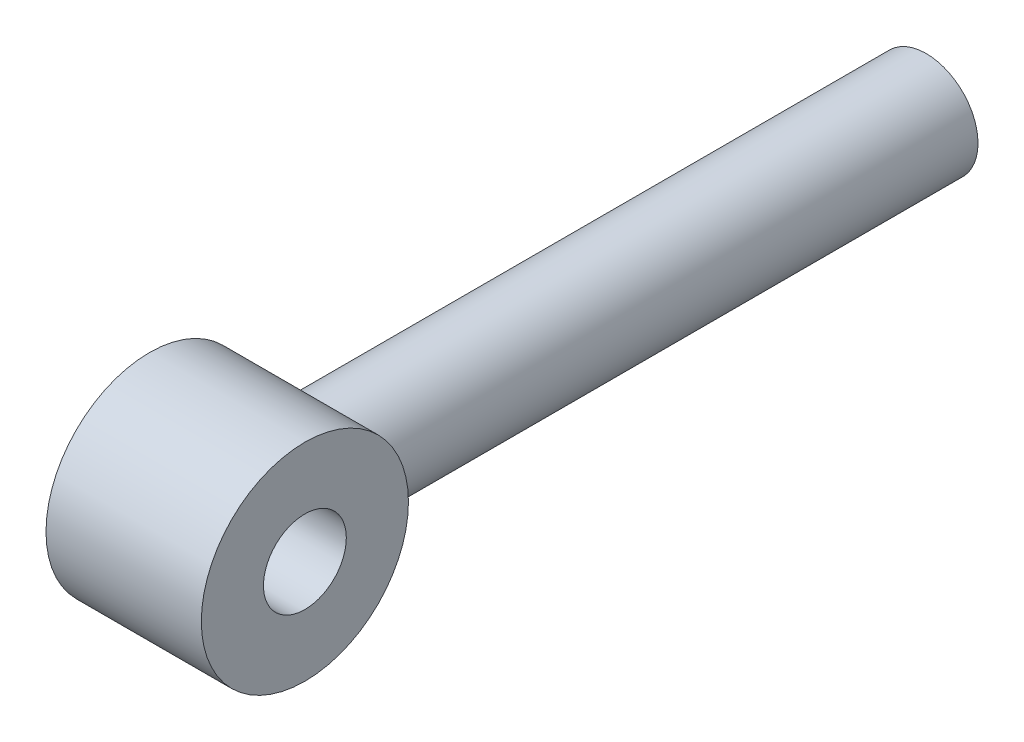
ISO-10303-21;
HEADER;
FILE_DESCRIPTION(('STEP AP214'),'2;1');
FILE_NAME('part.step','',(''),(''),'','','');
FILE_SCHEMA(('AUTOMOTIVE_DESIGN { 1 0 10303 214 1 1 1 1 }'));
ENDSEC;
DATA;
#1=APPLICATION_CONTEXT('core data for automotive mechanical design processes');
#2=APPLICATION_PROTOCOL_DEFINITION('international standard','automotive_design',2000,#1);
#3=PRODUCT_CONTEXT('',#1,'mechanical');
#4=PRODUCT('Part','Part','',(#3));
#5=PRODUCT_RELATED_PRODUCT_CATEGORY('part','',(#4));
#6=PRODUCT_DEFINITION_FORMATION('','',#4);
#7=PRODUCT_DEFINITION_CONTEXT('part definition',#1,'design');
#8=PRODUCT_DEFINITION('design','',#6,#7);
#9=PRODUCT_DEFINITION_SHAPE('','',#8);
#10=(LENGTH_UNIT() NAMED_UNIT(*) SI_UNIT(.MILLI.,.METRE.));
#11=(NAMED_UNIT(*) PLANE_ANGLE_UNIT() SI_UNIT($,.RADIAN.));
#12=(NAMED_UNIT(*) SI_UNIT($,.STERADIAN.) SOLID_ANGLE_UNIT());
#13=UNCERTAINTY_MEASURE_WITH_UNIT(LENGTH_MEASURE(1.E-05),#10,'distance_accuracy_value','');
#14=(GEOMETRIC_REPRESENTATION_CONTEXT(3) GLOBAL_UNCERTAINTY_ASSIGNED_CONTEXT((#13)) GLOBAL_UNIT_ASSIGNED_CONTEXT((#10,
#11,#12)) REPRESENTATION_CONTEXT('',''));
#15=CARTESIAN_POINT('',(0.,0.,0.));
#16=DIRECTION('',(0.,0.,1.));
#17=DIRECTION('',(1.,0.,0.));
#18=AXIS2_PLACEMENT_3D('',#15,#16,#17);
#19=CARTESIAN_POINT('',(3.,0.,0.));
#20=DIRECTION('',(-1.,0.,0.));
#21=DIRECTION('',(0.,0.,1.));
#22=AXIS2_PLACEMENT_3D('',#19,#20,#21);
#23=CYLINDRICAL_SURFACE('',#22,4.);
#24=CARTESIAN_POINT('',(2.,0.,-4.));
#25=CARTESIAN_POINT('',(1.99999339536562,-0.105143925902467,-3.99999426810082));
#26=CARTESIAN_POINT('',(1.99165985375789,-0.210413199395125,-3.99580982039513));
#27=CARTESIAN_POINT('',(1.95869423931692,-0.417840470537792,-3.97948312074314));
#28=CARTESIAN_POINT('',(1.93403121400437,-0.519992173427259,-3.96732575657839));
#29=CARTESIAN_POINT('',(1.86961238276674,-0.717867089760898,-3.93632558806751));
#30=CARTESIAN_POINT('',(1.82991523150406,-0.813613605878292,-3.91750878355075));
#31=CARTESIAN_POINT('',(1.73685875727003,-0.996945233613197,-3.87491553031523));
#32=CARTESIAN_POINT('',(1.68350051150227,-1.08453098798012,-3.8511394726705));
#33=CARTESIAN_POINT('',(1.56096550102943,-1.25501563552382,-3.79912516516124));
#34=CARTESIAN_POINT('',(1.49102704152072,-1.33731042224422,-3.77070398255074));
#35=CARTESIAN_POINT('',(1.33895704150593,-1.48955888973396,-3.71319940493486));
#36=CARTESIAN_POINT('',(1.25681629645512,-1.55950316621353,-3.68411552418069));
#37=CARTESIAN_POINT('',(1.07503330095324,-1.69050400090056,-3.62597902394695));
#38=CARTESIAN_POINT('',(0.974527803308175,-1.75045067110327,-3.59710373940264));
#39=CARTESIAN_POINT('',(0.763265328027571,-1.85233645378139,-3.54571957544641));
#40=CARTESIAN_POINT('',(0.652515742554502,-1.89428842993267,-3.52320615213979));
#41=CARTESIAN_POINT('',(0.430669789156155,-1.95626488437718,-3.48915734075617));
#42=CARTESIAN_POINT('',(0.319991095865212,-1.97745171416088,-3.47704543167427));
#43=CARTESIAN_POINT('',(0.0960423244410466,-2.00085398661769,-3.46363779897055));
#44=CARTESIAN_POINT('',(-0.0172250817423092,-2.00308817674615,-3.46233138686576));
#45=CARTESIAN_POINT('',(-0.228572048630736,-1.98937457434459,-3.47021860514497));
#46=CARTESIAN_POINT('',(-0.3268480624461,-1.97556911907364,-3.47817527324027));
#47=CARTESIAN_POINT('',(-0.519443818746084,-1.93387969811386,-3.50152457467701));
#48=CARTESIAN_POINT('',(-0.613762290610631,-1.9059912477953,-3.51691957663553));
#49=CARTESIAN_POINT('',(-0.798458265131318,-1.83641956077201,-3.55374952825482));
#50=CARTESIAN_POINT('',(-0.888692797571577,-1.79443013423199,-3.57531681327997));
#51=CARTESIAN_POINT('',(-1.06126858518002,-1.698083375336,-3.62206808562807));
#52=CARTESIAN_POINT('',(-1.14360627120018,-1.64372048762493,-3.64725369560381));
#53=CARTESIAN_POINT('',(-1.30904250548645,-1.51613210982558,-3.70226315806572));
#54=CARTESIAN_POINT('',(-1.39091374715231,-1.44138891673856,-3.73227020473492));
#55=CARTESIAN_POINT('',(-1.5414708371818,-1.27911115748275,-3.79095246600814));
#56=CARTESIAN_POINT('',(-1.61015038406777,-1.19157051314857,-3.81962703917602));
#57=CARTESIAN_POINT('',(-1.73537132205945,-1.0010330116637,-3.87403974565928));
#58=CARTESIAN_POINT('',(-1.79120094489148,-0.897507183198818,-3.89957968324015));
#59=CARTESIAN_POINT('',(-1.88419405808602,-0.680932430977594,-3.94315762242485));
#60=CARTESIAN_POINT('',(-1.92137237003033,-0.567891152530552,-3.96120157887106));
#61=CARTESIAN_POINT('',(-1.97295080743335,-0.345532983321405,-3.98648667482871));
#62=CARTESIAN_POINT('',(-1.98898247149356,-0.236683061096652,-3.9944987660262));
#63=CARTESIAN_POINT('',(-2.00292946226897,-0.0175591998987033,-4.00146026918207));
#64=CARTESIAN_POINT('',(-2.00085337127894,0.0927140397398172,-4.00041397442637));
#65=CARTESIAN_POINT('',(-1.97958662316251,0.302465943971974,-3.9898238450687));
#66=CARTESIAN_POINT('',(-1.96173493454001,0.40211881609986,-3.98094491376337));
#67=CARTESIAN_POINT('',(-1.91152385620976,0.596813784603882,-3.9564434262968));
#68=CARTESIAN_POINT('',(-1.87916286709301,0.691855371382174,-3.94082012668824));
#69=CARTESIAN_POINT('',(-1.80000306713393,0.877777216899145,-3.90368502827176));
#70=CARTESIAN_POINT('',(-1.75281789976743,0.968460794011607,-3.88201763539261));
#71=CARTESIAN_POINT('',(-1.64578492870686,1.14092272339854,-3.83487948634835));
#72=CARTESIAN_POINT('',(-1.58593173080921,1.22269725955318,-3.80940711133877));
#73=CARTESIAN_POINT('',(-1.44847914933857,1.38353537857843,-3.75416442672396));
#74=CARTESIAN_POINT('',(-1.36971426310971,1.46154415563805,-3.72421769686998));
#75=CARTESIAN_POINT('',(-1.20014969744454,1.60371264223771,-3.6652478321764));
#76=CARTESIAN_POINT('',(-1.10934176230416,1.66786277142375,-3.63622534800094));
#77=CARTESIAN_POINT('',(-0.912712691654048,1.78341582895804,-3.58102384412979));
#78=CARTESIAN_POINT('',(-0.806377467811037,1.8340509916005,-3.55505059178121));
#79=CARTESIAN_POINT('',(-0.584979864850068,1.91616565186941,-3.51148144588269));
#80=CARTESIAN_POINT('',(-0.469928947066219,1.94766983173403,-3.493874764435));
#81=CARTESIAN_POINT('',(-0.246179554230592,1.98772337493374,-3.47123002051604));
#82=CARTESIAN_POINT('',(-0.137931493129517,1.9981859928109,-3.4651476693013));
#83=CARTESIAN_POINT('',(0.0788941343290494,2.0013783087524,-3.46330709283206));
#84=CARTESIAN_POINT('',(0.187471537475723,1.99411569324648,-3.4675443925278));
#85=CARTESIAN_POINT('',(0.390967003066874,1.96385225118662,-3.48475724102153));
#86=CARTESIAN_POINT('',(0.486200940289479,1.94241662868607,-3.49686188965317));
#87=CARTESIAN_POINT('',(0.671616238848733,1.88635071644882,-3.52742032375305));
#88=CARTESIAN_POINT('',(0.761795964184063,1.85171618231984,-3.54587615139337));
#89=CARTESIAN_POINT('',(0.941249701973074,1.76763149060113,-3.58857060729071));
#90=CARTESIAN_POINT('',(1.03005580365806,1.7173422756314,-3.61311444791841));
#91=CARTESIAN_POINT('',(1.19854907236252,1.60430194327478,-3.66470663269721));
#92=CARTESIAN_POINT('',(1.27823146104222,1.54154434248312,-3.69175627591221));
#93=CARTESIAN_POINT('',(1.43628396470935,1.39640665332275,-3.74924646316184));
#94=CARTESIAN_POINT('',(1.51331820470058,1.31256884599452,-3.77969966613256));
#95=CARTESIAN_POINT('',(1.65252596687054,1.13230961246639,-3.83755504519861));
#96=CARTESIAN_POINT('',(1.71469147893981,1.03588144661039,-3.8649555725239));
#97=CARTESIAN_POINT('',(1.82247272542414,0.831863193565891,-3.91396019133075));
#98=CARTESIAN_POINT('',(1.86796833847294,0.72419900755346,-3.93552192987866));
#99=CARTESIAN_POINT('',(1.93961633551482,0.501484202276172,-3.97002682597974));
#100=CARTESIAN_POINT('',(1.96582369361143,0.3864555991782,-3.98299446726136));
#101=CARTESIAN_POINT('',(1.98779482217148,0.22520389298179,-3.99390923826956));
#102=CARTESIAN_POINT('',(1.99236528173268,0.18032375888313,-3.99618730680502));
#103=CARTESIAN_POINT('',(1.99846933102817,0.0903034636101831,-3.99923393953631));
#104=CARTESIAN_POINT('',(2.00000283694042,0.0451632952932568,-4.00000246206762));
#105=CARTESIAN_POINT('',(2.,0.,-4.));
#106=B_SPLINE_CURVE_WITH_KNOTS('',3,(#24,#25,#26,#27,#28,#29,#30,#31,#32,#33,#34,#35,#36,#37,
#38,#39,#40,#41,#42,#43,#44,#45,#46,#47,#48,#49,#50,#51,#52,#53,#54,#55,#56,#57,#58,#59,#60,#61,
#62,#63,#64,#65,#66,#67,#68,#69,#70,#71,#72,#73,#74,#75,#76,#77,#78,#79,#80,#81,#82,#83,#84,#85,
#86,#87,#88,#89,#90,#91,#92,#93,#94,#95,#96,#97,#98,#99,#100,#101,#102,#103,#104,#105),
.UNSPECIFIED.,.T.,.F.,(4,2,2,2,2,2,2,2,2,2,2,2,2,2,2,2,2,2,2,2,2,2,2,2,2,2,2,2,2,2,2,2,2,2,2,2,
2,2,2,2,4),(0.,0.315248514840585,0.631096299418395,0.945724310984597,1.26032752116314,
1.59396351743618,1.92785247530807,2.28763452861505,2.64715895796562,2.98516024280459,
3.32282714658041,3.62011424818641,3.91749607851357,4.22180480336975,4.52625042520444,
4.86929882667757,5.21251069197373,5.57166044428881,5.93052433824559,6.25966580942691,
6.58865129022952,6.89213813012244,7.19565843261863,7.50785712055797,7.82018901496679,
8.16319221288838,8.50643177230864,8.86629364323452,9.22569023890902,9.55058615006093,
9.87534119729357,10.1691586049771,10.463070575767,10.7767291356057,11.0905512228726,
11.4425048551434,11.7946476676249,12.1492802732705,12.502898172423,12.6383056026783,
12.7737167702213),.UNSPECIFIED.);
#107=CARTESIAN_POINT('',(2.,0.,-4.));
#108=VERTEX_POINT('',#107);
#109=EDGE_CURVE('E40',#108,#108,#106,.T.);
#110=ORIENTED_EDGE('',*,*,#109,.F.);
#111=EDGE_LOOP('',(#110));
#112=FACE_BOUND('',#111,.T.);
#113=CARTESIAN_POINT('',(3.,0.,0.));
#114=DIRECTION('',(1.,0.,0.));
#115=DIRECTION('',(0.,0.,-1.));
#116=AXIS2_PLACEMENT_3D('',#113,#114,#115);
#117=CIRCLE('',#116,4.);
#118=CARTESIAN_POINT('',(3.,0.,-4.));
#119=VERTEX_POINT('',#118);
#120=EDGE_CURVE('E51',#119,#119,#117,.T.);
#121=ORIENTED_EDGE('',*,*,#120,.F.);
#122=EDGE_LOOP('',(#121));
#123=FACE_BOUND('',#122,.T.);
#124=CARTESIAN_POINT('',(-3.,0.,0.));
#125=DIRECTION('',(1.,0.,0.));
#126=DIRECTION('',(0.,0.,-1.));
#127=AXIS2_PLACEMENT_3D('',#124,#125,#126);
#128=CIRCLE('',#127,4.);
#129=CARTESIAN_POINT('',(-3.,0.,-4.));
#130=VERTEX_POINT('',#129);
#131=EDGE_CURVE('E53',#130,#130,#128,.T.);
#132=ORIENTED_EDGE('',*,*,#131,.T.);
#133=EDGE_LOOP('',(#132));
#134=FACE_BOUND('',#133,.T.);
#135=ADVANCED_FACE('F36',(#112,#123,#134),#23,.T.);
#136=CARTESIAN_POINT('',(3.,0.,0.));
#137=DIRECTION('',(1.,0.,0.));
#138=DIRECTION('',(0.,0.,-1.));
#139=AXIS2_PLACEMENT_3D('',#136,#137,#138);
#140=PLANE('',#139);
#141=CARTESIAN_POINT('',(3.,0.,0.));
#142=DIRECTION('',(1.,0.,0.));
#143=DIRECTION('',(0.,0.,-1.));
#144=AXIS2_PLACEMENT_3D('',#141,#142,#143);
#145=CIRCLE('',#144,1.6);
#146=CARTESIAN_POINT('',(3.,0.,-1.6));
#147=VERTEX_POINT('',#146);
#148=EDGE_CURVE('E59',#147,#147,#145,.T.);
#149=ORIENTED_EDGE('',*,*,#148,.F.);
#150=EDGE_LOOP('',(#149));
#151=FACE_BOUND('',#150,.T.);
#152=ORIENTED_EDGE('',*,*,#120,.T.);
#153=EDGE_LOOP('',(#152));
#154=FACE_BOUND('',#153,.T.);
#155=ADVANCED_FACE('F74',(#151,#154),#140,.T.);
#156=CARTESIAN_POINT('',(-3.,0.,0.));
#157=DIRECTION('',(1.,0.,0.));
#158=DIRECTION('',(0.,0.,-1.));
#159=AXIS2_PLACEMENT_3D('',#156,#157,#158);
#160=PLANE('',#159);
#161=CARTESIAN_POINT('',(-3.,0.,0.));
#162=DIRECTION('',(1.,0.,0.));
#163=DIRECTION('',(0.,0.,-1.));
#164=AXIS2_PLACEMENT_3D('',#161,#162,#163);
#165=CIRCLE('',#164,1.6);
#166=CARTESIAN_POINT('',(-3.,0.,-1.6));
#167=VERTEX_POINT('',#166);
#168=EDGE_CURVE('E56',#167,#167,#165,.T.);
#169=ORIENTED_EDGE('',*,*,#168,.T.);
#170=EDGE_LOOP('',(#169));
#171=FACE_BOUND('',#170,.T.);
#172=ORIENTED_EDGE('',*,*,#131,.F.);
#173=EDGE_LOOP('',(#172));
#174=FACE_BOUND('',#173,.T.);
#175=ADVANCED_FACE('F65',(#171,#174),#160,.F.);
#176=CARTESIAN_POINT('',(0.,0.,10.123));
#177=DIRECTION('',(0.,0.,1.));
#178=DIRECTION('',(1.,0.,0.));
#179=AXIS2_PLACEMENT_3D('',#176,#177,#178);
#180=CYLINDRICAL_SURFACE('',#179,2.);
#181=CARTESIAN_POINT('',(0.,0.,-27.));
#182=DIRECTION('',(0.,0.,1.));
#183=DIRECTION('',(1.,0.,0.));
#184=AXIS2_PLACEMENT_3D('',#181,#182,#183);
#185=CIRCLE('',#184,2.);
#186=CARTESIAN_POINT('',(2.,0.,-27.));
#187=VERTEX_POINT('',#186);
#188=EDGE_CURVE('E10',#187,#187,#185,.T.);
#189=ORIENTED_EDGE('',*,*,#188,.T.);
#190=EDGE_LOOP('',(#189));
#191=FACE_BOUND('',#190,.T.);
#192=ORIENTED_EDGE('',*,*,#109,.T.);
#193=EDGE_LOOP('',(#192));
#194=FACE_BOUND('',#193,.T.);
#195=ADVANCED_FACE('F85',(#191,#194),#180,.T.);
#196=CARTESIAN_POINT('',(0.,0.,-27.));
#197=DIRECTION('',(0.,0.,-1.));
#198=DIRECTION('',(-1.,0.,0.));
#199=AXIS2_PLACEMENT_3D('',#196,#197,#198);
#200=PLANE('',#199);
#201=ORIENTED_EDGE('',*,*,#188,.F.);
#202=EDGE_LOOP('',(#201));
#203=FACE_BOUND('',#202,.T.);
#204=ADVANCED_FACE('F38',(#203),#200,.T.);
#205=CARTESIAN_POINT('',(-3.,0.,0.));
#206=DIRECTION('',(1.,0.,0.));
#207=DIRECTION('',(0.,0.,-1.));
#208=AXIS2_PLACEMENT_3D('',#205,#206,#207);
#209=CYLINDRICAL_SURFACE('',#208,1.6);
#210=ORIENTED_EDGE('',*,*,#168,.F.);
#211=EDGE_LOOP('',(#210));
#212=FACE_BOUND('',#211,.T.);
#213=ORIENTED_EDGE('',*,*,#148,.T.);
#214=EDGE_LOOP('',(#213));
#215=FACE_BOUND('',#214,.T.);
#216=ADVANCED_FACE('F68',(#212,#215),#209,.F.);
#217=CLOSED_SHELL('',(#135,#155,#175,#195,#204,#216));
#218=MANIFOLD_SOLID_BREP('B2',#217);
#219=ADVANCED_BREP_SHAPE_REPRESENTATION('',(#18,#218),#14);
#220=SHAPE_DEFINITION_REPRESENTATION(#9,#219);
ENDSEC;
END-ISO-10303-21;
